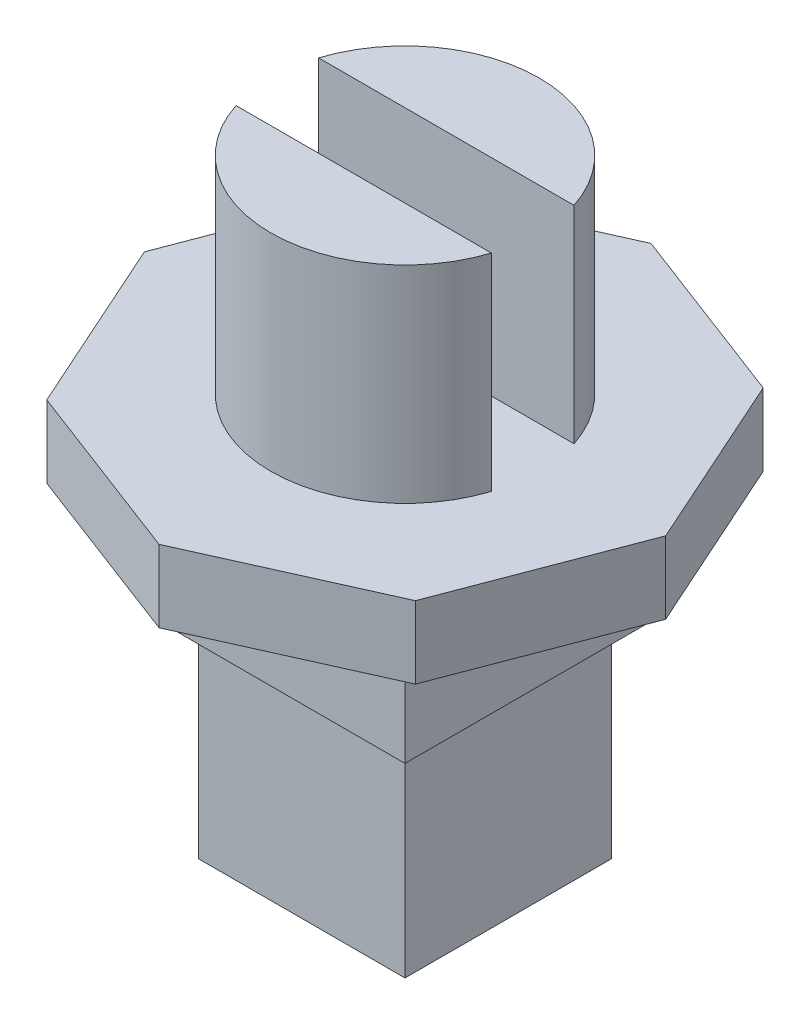
ISO-10303-21;
HEADER;
FILE_DESCRIPTION(('STEP AP214'),'2;1');
FILE_NAME('part.step','',(''),(''),'','','');
FILE_SCHEMA(('AUTOMOTIVE_DESIGN { 1 0 10303 214 1 1 1 1 }'));
ENDSEC;
DATA;
#1=APPLICATION_CONTEXT('core data for automotive mechanical design processes');
#2=APPLICATION_PROTOCOL_DEFINITION('international standard','automotive_design',2000,#1);
#3=PRODUCT_CONTEXT('',#1,'mechanical');
#4=PRODUCT('Part','Part','',(#3));
#5=PRODUCT_RELATED_PRODUCT_CATEGORY('part','',(#4));
#6=PRODUCT_DEFINITION_FORMATION('','',#4);
#7=PRODUCT_DEFINITION_CONTEXT('part definition',#1,'design');
#8=PRODUCT_DEFINITION('design','',#6,#7);
#9=PRODUCT_DEFINITION_SHAPE('','',#8);
#10=(LENGTH_UNIT() NAMED_UNIT(*) SI_UNIT(.MILLI.,.METRE.));
#11=(NAMED_UNIT(*) PLANE_ANGLE_UNIT() SI_UNIT($,.RADIAN.));
#12=(NAMED_UNIT(*) SI_UNIT($,.STERADIAN.) SOLID_ANGLE_UNIT());
#13=UNCERTAINTY_MEASURE_WITH_UNIT(LENGTH_MEASURE(1.E-05),#10,'distance_accuracy_value','');
#14=(GEOMETRIC_REPRESENTATION_CONTEXT(3) GLOBAL_UNCERTAINTY_ASSIGNED_CONTEXT((#13)) GLOBAL_UNIT_ASSIGNED_CONTEXT((#10,
#11,#12)) REPRESENTATION_CONTEXT('',''));
#15=CARTESIAN_POINT('',(0.,0.,0.));
#16=DIRECTION('',(0.,0.,1.));
#17=DIRECTION('',(1.,0.,0.));
#18=AXIS2_PLACEMENT_3D('',#15,#16,#17);
#19=CARTESIAN_POINT('',(5.,-10.,-5.));
#20=DIRECTION('',(1.,0.,0.));
#21=DIRECTION('',(0.,0.,-1.));
#22=AXIS2_PLACEMENT_3D('',#19,#20,#21);
#23=PLANE('',#22);
#24=DIRECTION('',(0.,0.,-1.));
#25=VECTOR('',#24,1.);
#26=CARTESIAN_POINT('',(5.,0.,-5.));
#27=LINE('',#26,#25);
#28=CARTESIAN_POINT('',(5.,0.,5.));
#29=VERTEX_POINT('',#28);
#30=CARTESIAN_POINT('',(5.,0.,-5.));
#31=VERTEX_POINT('',#30);
#32=EDGE_CURVE('E350',#29,#31,#27,.T.);
#33=ORIENTED_EDGE('',*,*,#32,.F.);
#34=DIRECTION('',(0.,1.,0.));
#35=VECTOR('',#34,1.);
#36=CARTESIAN_POINT('',(5.,-10.,5.));
#37=LINE('',#36,#35);
#38=CARTESIAN_POINT('',(5.,-10.,5.));
#39=VERTEX_POINT('',#38);
#40=EDGE_CURVE('E11',#39,#29,#37,.T.);
#41=ORIENTED_EDGE('',*,*,#40,.F.);
#42=DIRECTION('',(0.,0.,-1.));
#43=VECTOR('',#42,1.);
#44=CARTESIAN_POINT('',(5.,-10.,-5.));
#45=LINE('',#44,#43);
#46=CARTESIAN_POINT('',(5.,-10.,-5.));
#47=VERTEX_POINT('',#46);
#48=EDGE_CURVE('E351',#39,#47,#45,.T.);
#49=ORIENTED_EDGE('',*,*,#48,.T.);
#50=DIRECTION('',(0.,1.,0.));
#51=VECTOR('',#50,1.);
#52=CARTESIAN_POINT('',(5.,-10.,-5.));
#53=LINE('',#52,#51);
#54=EDGE_CURVE('E42',#47,#31,#53,.T.);
#55=ORIENTED_EDGE('',*,*,#54,.T.);
#56=EDGE_LOOP('',(#33,#41,#49,#55));
#57=FACE_BOUND('',#56,.T.);
#58=ADVANCED_FACE('F39',(#57),#23,.T.);
#59=CARTESIAN_POINT('',(-5.,-10.,5.));
#60=DIRECTION('',(0.,0.,1.));
#61=DIRECTION('',(1.,0.,0.));
#62=AXIS2_PLACEMENT_3D('',#59,#60,#61);
#63=PLANE('',#62);
#64=DIRECTION('',(1.,0.,0.));
#65=VECTOR('',#64,1.);
#66=CARTESIAN_POINT('',(-5.,0.,5.));
#67=LINE('',#66,#65);
#68=CARTESIAN_POINT('',(-5.,0.,5.));
#69=VERTEX_POINT('',#68);
#70=EDGE_CURVE('E356',#69,#29,#67,.T.);
#71=ORIENTED_EDGE('',*,*,#70,.F.);
#72=DIRECTION('',(0.,1.,0.));
#73=VECTOR('',#72,1.);
#74=CARTESIAN_POINT('',(-5.,-10.,5.));
#75=LINE('',#74,#73);
#76=CARTESIAN_POINT('',(-5.,-10.,5.));
#77=VERTEX_POINT('',#76);
#78=EDGE_CURVE('E48',#77,#69,#75,.T.);
#79=ORIENTED_EDGE('',*,*,#78,.F.);
#80=DIRECTION('',(1.,0.,0.));
#81=VECTOR('',#80,1.);
#82=CARTESIAN_POINT('',(-5.,-10.,5.));
#83=LINE('',#82,#81);
#84=EDGE_CURVE('E364',#77,#39,#83,.T.);
#85=ORIENTED_EDGE('',*,*,#84,.T.);
#86=ORIENTED_EDGE('',*,*,#40,.T.);
#87=EDGE_LOOP('',(#71,#79,#85,#86));
#88=FACE_BOUND('',#87,.T.);
#89=ADVANCED_FACE('F397',(#88),#63,.T.);
#90=CARTESIAN_POINT('',(-5.,-10.,-5.));
#91=DIRECTION('',(-1.,0.,0.));
#92=DIRECTION('',(0.,0.,1.));
#93=AXIS2_PLACEMENT_3D('',#90,#91,#92);
#94=PLANE('',#93);
#95=DIRECTION('',(0.,0.,1.));
#96=VECTOR('',#95,1.);
#97=CARTESIAN_POINT('',(-5.,0.,-5.));
#98=LINE('',#97,#96);
#99=CARTESIAN_POINT('',(-5.,0.,-5.));
#100=VERTEX_POINT('',#99);
#101=EDGE_CURVE('E375',#100,#69,#98,.T.);
#102=ORIENTED_EDGE('',*,*,#101,.F.);
#103=DIRECTION('',(0.,1.,0.));
#104=VECTOR('',#103,1.);
#105=CARTESIAN_POINT('',(-5.,-10.,-5.));
#106=LINE('',#105,#104);
#107=CARTESIAN_POINT('',(-5.,-10.,-5.));
#108=VERTEX_POINT('',#107);
#109=EDGE_CURVE('E383',#108,#100,#106,.T.);
#110=ORIENTED_EDGE('',*,*,#109,.F.);
#111=DIRECTION('',(0.,0.,1.));
#112=VECTOR('',#111,1.);
#113=CARTESIAN_POINT('',(-5.,-10.,-5.));
#114=LINE('',#113,#112);
#115=EDGE_CURVE('E360',#108,#77,#114,.T.);
#116=ORIENTED_EDGE('',*,*,#115,.T.);
#117=ORIENTED_EDGE('',*,*,#78,.T.);
#118=EDGE_LOOP('',(#102,#110,#116,#117));
#119=FACE_BOUND('',#118,.T.);
#120=ADVANCED_FACE('F403',(#119),#94,.T.);
#121=CARTESIAN_POINT('',(-5.,-10.,-5.));
#122=DIRECTION('',(0.,0.,-1.));
#123=DIRECTION('',(-1.,0.,0.));
#124=AXIS2_PLACEMENT_3D('',#121,#122,#123);
#125=PLANE('',#124);
#126=DIRECTION('',(-1.,0.,0.));
#127=VECTOR('',#126,1.);
#128=CARTESIAN_POINT('',(-5.,0.,-5.));
#129=LINE('',#128,#127);
#130=EDGE_CURVE('E371',#31,#100,#129,.T.);
#131=ORIENTED_EDGE('',*,*,#130,.F.);
#132=ORIENTED_EDGE('',*,*,#54,.F.);
#133=DIRECTION('',(-1.,0.,0.));
#134=VECTOR('',#133,1.);
#135=CARTESIAN_POINT('',(-5.,-10.,-5.));
#136=LINE('',#135,#134);
#137=EDGE_CURVE('E355',#47,#108,#136,.T.);
#138=ORIENTED_EDGE('',*,*,#137,.T.);
#139=ORIENTED_EDGE('',*,*,#109,.T.);
#140=EDGE_LOOP('',(#131,#132,#138,#139));
#141=FACE_BOUND('',#140,.T.);
#142=ADVANCED_FACE('F392',(#141),#125,.T.);
#143=CARTESIAN_POINT('',(0.,-10.,0.));
#144=DIRECTION('',(0.,1.,0.));
#145=DIRECTION('',(0.,0.,1.));
#146=AXIS2_PLACEMENT_3D('',#143,#144,#145);
#147=PLANE('',#146);
#148=ORIENTED_EDGE('',*,*,#48,.F.);
#149=ORIENTED_EDGE('',*,*,#84,.F.);
#150=ORIENTED_EDGE('',*,*,#115,.F.);
#151=ORIENTED_EDGE('',*,*,#137,.F.);
#152=EDGE_LOOP('',(#148,#149,#150,#151));
#153=FACE_BOUND('',#152,.T.);
#154=ADVANCED_FACE('F400',(#153),#147,.F.);
#155=CARTESIAN_POINT('',(0.,0.,0.));
#156=DIRECTION('',(0.,1.,0.));
#157=DIRECTION('',(0.,0.,1.));
#158=AXIS2_PLACEMENT_3D('',#155,#156,#157);
#159=PLANE('',#158);
#160=DIRECTION('',(0.,0.,-1.));
#161=VECTOR('',#160,1.);
#162=CARTESIAN_POINT('',(6.,0.,-6.));
#163=LINE('',#162,#161);
#164=CARTESIAN_POINT('',(6.,0.,6.));
#165=VERTEX_POINT('',#164);
#166=CARTESIAN_POINT('',(6.,0.,-6.));
#167=VERTEX_POINT('',#166);
#168=EDGE_CURVE('E305',#165,#167,#163,.T.);
#169=ORIENTED_EDGE('',*,*,#168,.F.);
#170=DIRECTION('',(1.,0.,0.));
#171=VECTOR('',#170,1.);
#172=CARTESIAN_POINT('',(-6.,0.,6.));
#173=LINE('',#172,#171);
#174=CARTESIAN_POINT('',(-6.,0.,6.));
#175=VERTEX_POINT('',#174);
#176=EDGE_CURVE('E311',#175,#165,#173,.T.);
#177=ORIENTED_EDGE('',*,*,#176,.F.);
#178=DIRECTION('',(0.,0.,1.));
#179=VECTOR('',#178,1.);
#180=CARTESIAN_POINT('',(-6.,0.,-6.));
#181=LINE('',#180,#179);
#182=CARTESIAN_POINT('',(-6.,0.,-6.));
#183=VERTEX_POINT('',#182);
#184=EDGE_CURVE('E330',#183,#175,#181,.T.);
#185=ORIENTED_EDGE('',*,*,#184,.F.);
#186=DIRECTION('',(-1.,0.,0.));
#187=VECTOR('',#186,1.);
#188=CARTESIAN_POINT('',(-6.,0.,-6.));
#189=LINE('',#188,#187);
#190=EDGE_CURVE('E327',#167,#183,#189,.T.);
#191=ORIENTED_EDGE('',*,*,#190,.F.);
#192=EDGE_LOOP('',(#169,#177,#185,#191));
#193=FACE_BOUND('',#192,.T.);
#194=ORIENTED_EDGE('',*,*,#70,.T.);
#195=ORIENTED_EDGE('',*,*,#32,.T.);
#196=ORIENTED_EDGE('',*,*,#130,.T.);
#197=ORIENTED_EDGE('',*,*,#101,.T.);
#198=EDGE_LOOP('',(#194,#195,#196,#197));
#199=FACE_BOUND('',#198,.T.);
#200=ADVANCED_FACE('F394',(#193,#199),#159,.F.);
#201=CARTESIAN_POINT('',(6.,6.,-6.));
#202=DIRECTION('',(-1.,0.,0.));
#203=DIRECTION('',(0.,0.,1.));
#204=AXIS2_PLACEMENT_3D('',#201,#202,#203);
#205=PLANE('',#204);
#206=ORIENTED_EDGE('',*,*,#168,.T.);
#207=DIRECTION('',(0.,-1.,0.));
#208=VECTOR('',#207,1.);
#209=CARTESIAN_POINT('',(6.,6.,-6.));
#210=LINE('',#209,#208);
#211=CARTESIAN_POINT('',(6.,6.,-6.));
#212=VERTEX_POINT('',#211);
#213=EDGE_CURVE('E346',#212,#167,#210,.T.);
#214=ORIENTED_EDGE('',*,*,#213,.F.);
#215=DIRECTION('',(0.,0.,-1.));
#216=VECTOR('',#215,1.);
#217=CARTESIAN_POINT('',(6.,6.,-6.));
#218=LINE('',#217,#216);
#219=CARTESIAN_POINT('',(6.,6.,6.));
#220=VERTEX_POINT('',#219);
#221=EDGE_CURVE('E306',#220,#212,#218,.T.);
#222=ORIENTED_EDGE('',*,*,#221,.F.);
#223=DIRECTION('',(0.,-1.,0.));
#224=VECTOR('',#223,1.);
#225=CARTESIAN_POINT('',(6.,6.,6.));
#226=LINE('',#225,#224);
#227=EDGE_CURVE('E323',#220,#165,#226,.T.);
#228=ORIENTED_EDGE('',*,*,#227,.T.);
#229=EDGE_LOOP('',(#206,#214,#222,#228));
#230=FACE_BOUND('',#229,.T.);
#231=ADVANCED_FACE('F440',(#230),#205,.F.);
#232=CARTESIAN_POINT('',(-6.,6.,-6.));
#233=DIRECTION('',(0.,0.,1.));
#234=DIRECTION('',(1.,0.,0.));
#235=AXIS2_PLACEMENT_3D('',#232,#233,#234);
#236=PLANE('',#235);
#237=ORIENTED_EDGE('',*,*,#190,.T.);
#238=DIRECTION('',(0.,-1.,0.));
#239=VECTOR('',#238,1.);
#240=CARTESIAN_POINT('',(-6.,6.,-6.));
#241=LINE('',#240,#239);
#242=CARTESIAN_POINT('',(-6.,6.,-6.));
#243=VERTEX_POINT('',#242);
#244=EDGE_CURVE('E342',#243,#183,#241,.T.);
#245=ORIENTED_EDGE('',*,*,#244,.F.);
#246=DIRECTION('',(-1.,0.,0.));
#247=VECTOR('',#246,1.);
#248=CARTESIAN_POINT('',(-6.,6.,-6.));
#249=LINE('',#248,#247);
#250=EDGE_CURVE('E310',#212,#243,#249,.T.);
#251=ORIENTED_EDGE('',*,*,#250,.F.);
#252=ORIENTED_EDGE('',*,*,#213,.T.);
#253=EDGE_LOOP('',(#237,#245,#251,#252));
#254=FACE_BOUND('',#253,.T.);
#255=ADVANCED_FACE('F450',(#254),#236,.F.);
#256=CARTESIAN_POINT('',(-6.,6.,-6.));
#257=DIRECTION('',(1.,0.,0.));
#258=DIRECTION('',(0.,0.,-1.));
#259=AXIS2_PLACEMENT_3D('',#256,#257,#258);
#260=PLANE('',#259);
#261=ORIENTED_EDGE('',*,*,#184,.T.);
#262=DIRECTION('',(0.,-1.,0.));
#263=VECTOR('',#262,1.);
#264=CARTESIAN_POINT('',(-6.,6.,6.));
#265=LINE('',#264,#263);
#266=CARTESIAN_POINT('',(-6.,6.,6.));
#267=VERTEX_POINT('',#266);
#268=EDGE_CURVE('E338',#267,#175,#265,.T.);
#269=ORIENTED_EDGE('',*,*,#268,.F.);
#270=DIRECTION('',(0.,0.,1.));
#271=VECTOR('',#270,1.);
#272=CARTESIAN_POINT('',(-6.,6.,-6.));
#273=LINE('',#272,#271);
#274=EDGE_CURVE('E315',#243,#267,#273,.T.);
#275=ORIENTED_EDGE('',*,*,#274,.F.);
#276=ORIENTED_EDGE('',*,*,#244,.T.);
#277=EDGE_LOOP('',(#261,#269,#275,#276));
#278=FACE_BOUND('',#277,.T.);
#279=ADVANCED_FACE('F460',(#278),#260,.F.);
#280=CARTESIAN_POINT('',(-6.,6.,6.));
#281=DIRECTION('',(0.,0.,-1.));
#282=DIRECTION('',(-1.,0.,0.));
#283=AXIS2_PLACEMENT_3D('',#280,#281,#282);
#284=PLANE('',#283);
#285=ORIENTED_EDGE('',*,*,#176,.T.);
#286=ORIENTED_EDGE('',*,*,#227,.F.);
#287=DIRECTION('',(1.,0.,0.));
#288=VECTOR('',#287,1.);
#289=CARTESIAN_POINT('',(-6.,6.,6.));
#290=LINE('',#289,#288);
#291=EDGE_CURVE('E319',#267,#220,#290,.T.);
#292=ORIENTED_EDGE('',*,*,#291,.F.);
#293=ORIENTED_EDGE('',*,*,#268,.T.);
#294=EDGE_LOOP('',(#285,#286,#292,#293));
#295=FACE_BOUND('',#294,.T.);
#296=ADVANCED_FACE('F470',(#295),#284,.F.);
#297=CARTESIAN_POINT('',(0.,6.,0.));
#298=DIRECTION('',(0.,1.,0.));
#299=DIRECTION('',(0.,0.,1.));
#300=AXIS2_PLACEMENT_3D('',#297,#298,#299);
#301=PLANE('',#300);
#302=DIRECTION('',(0.934598802416425,0.,0.355703638611954));
#303=VECTOR('',#302,1.);
#304=CARTESIAN_POINT('',(-8.42213623561176,6.,8.92593112096714));
#305=LINE('',#304,#303);
#306=CARTESIAN_POINT('',(-8.42213623561176,6.,8.92593112096714));
#307=VERTEX_POINT('',#306);
#308=CARTESIAN_POINT('',(0.356236779761883,6.,12.2669360683179));
#309=VERTEX_POINT('',#308);
#310=EDGE_CURVE('E223',#307,#309,#305,.T.);
#311=ORIENTED_EDGE('',*,*,#310,.F.);
#312=DIRECTION('',(0.409340695922239,0.,0.912381605832722));
#313=VECTOR('',#312,1.);
#314=CARTESIAN_POINT('',(-12.2669360683179,6.,0.356236779761885));
#315=LINE('',#314,#313);
#316=CARTESIAN_POINT('',(-12.2669360683179,6.,0.356236779761885));
#317=VERTEX_POINT('',#316);
#318=EDGE_CURVE('E229',#317,#307,#315,.T.);
#319=ORIENTED_EDGE('',*,*,#318,.F.);
#320=DIRECTION('',(-0.355703638611954,0.,0.934598802416425));
#321=VECTOR('',#320,1.);
#322=CARTESIAN_POINT('',(-8.92593112096714,6.,-8.42213623561176));
#323=LINE('',#322,#321);
#324=CARTESIAN_POINT('',(-8.92593112096714,6.,-8.42213623561176));
#325=VERTEX_POINT('',#324);
#326=EDGE_CURVE('E269',#325,#317,#323,.T.);
#327=ORIENTED_EDGE('',*,*,#326,.F.);
#328=DIRECTION('',(-0.912381605832722,0.,0.409340695922239));
#329=VECTOR('',#328,1.);
#330=CARTESIAN_POINT('',(-0.356236779761888,6.,-12.2669360683179));
#331=LINE('',#330,#329);
#332=CARTESIAN_POINT('',(-0.356236779761888,6.,-12.2669360683179));
#333=VERTEX_POINT('',#332);
#334=EDGE_CURVE('E266',#333,#325,#331,.T.);
#335=ORIENTED_EDGE('',*,*,#334,.F.);
#336=DIRECTION('',(-0.934598802416425,0.,-0.355703638611954));
#337=VECTOR('',#336,1.);
#338=CARTESIAN_POINT('',(8.42213623561176,6.,-8.92593112096714));
#339=LINE('',#338,#337);
#340=CARTESIAN_POINT('',(8.42213623561176,6.,-8.92593112096714));
#341=VERTEX_POINT('',#340);
#342=EDGE_CURVE('E263',#341,#333,#339,.T.);
#343=ORIENTED_EDGE('',*,*,#342,.F.);
#344=DIRECTION('',(-0.409340695922239,0.,-0.912381605832722));
#345=VECTOR('',#344,1.);
#346=CARTESIAN_POINT('',(12.2669360683179,6.,-0.356236779761891));
#347=LINE('',#346,#345);
#348=CARTESIAN_POINT('',(12.2669360683179,6.,-0.356236779761891));
#349=VERTEX_POINT('',#348);
#350=EDGE_CURVE('E260',#349,#341,#347,.T.);
#351=ORIENTED_EDGE('',*,*,#350,.F.);
#352=DIRECTION('',(0.355703638611954,0.,-0.934598802416425));
#353=VECTOR('',#352,1.);
#354=CARTESIAN_POINT('',(8.92593112096713,6.,8.42213623561176));
#355=LINE('',#354,#353);
#356=CARTESIAN_POINT('',(8.92593112096713,6.,8.42213623561176));
#357=VERTEX_POINT('',#356);
#358=EDGE_CURVE('E257',#357,#349,#355,.T.);
#359=ORIENTED_EDGE('',*,*,#358,.F.);
#360=DIRECTION('',(0.912381605832722,0.,-0.409340695922239));
#361=VECTOR('',#360,1.);
#362=CARTESIAN_POINT('',(0.356236779761883,6.,12.2669360683179));
#363=LINE('',#362,#361);
#364=EDGE_CURVE('E254',#309,#357,#363,.T.);
#365=ORIENTED_EDGE('',*,*,#364,.F.);
#366=EDGE_LOOP('',(#311,#319,#327,#335,#343,#351,#359,#365));
#367=FACE_BOUND('',#366,.T.);
#368=ORIENTED_EDGE('',*,*,#291,.T.);
#369=ORIENTED_EDGE('',*,*,#221,.T.);
#370=ORIENTED_EDGE('',*,*,#250,.T.);
#371=ORIENTED_EDGE('',*,*,#274,.T.);
#372=EDGE_LOOP('',(#368,#369,#370,#371));
#373=FACE_BOUND('',#372,.T.);
#374=ADVANCED_FACE('F480',(#367,#373),#301,.F.);
#375=CARTESIAN_POINT('',(-8.42213623561176,9.5,8.92593112096714));
#376=DIRECTION('',(0.355703638611954,0.,-0.934598802416425));
#377=DIRECTION('',(-0.934598802416425,0.,-0.355703638611954));
#378=AXIS2_PLACEMENT_3D('',#375,#376,#377);
#379=PLANE('',#378);
#380=ORIENTED_EDGE('',*,*,#310,.T.);
#381=DIRECTION('',(0.,-1.,0.));
#382=VECTOR('',#381,1.);
#383=CARTESIAN_POINT('',(0.356236779761883,9.5,12.2669360683179));
#384=LINE('',#383,#382);
#385=CARTESIAN_POINT('',(0.356236779761883,9.5,12.2669360683179));
#386=VERTEX_POINT('',#385);
#387=EDGE_CURVE('E301',#386,#309,#384,.T.);
#388=ORIENTED_EDGE('',*,*,#387,.F.);
#389=DIRECTION('',(0.934598802416425,0.,0.355703638611954));
#390=VECTOR('',#389,1.);
#391=CARTESIAN_POINT('',(-8.42213623561176,9.5,8.92593112096714));
#392=LINE('',#391,#390);
#393=CARTESIAN_POINT('',(-8.42213623561176,9.5,8.92593112096714));
#394=VERTEX_POINT('',#393);
#395=EDGE_CURVE('E224',#394,#386,#392,.T.);
#396=ORIENTED_EDGE('',*,*,#395,.F.);
#397=DIRECTION('',(0.,-1.,0.));
#398=VECTOR('',#397,1.);
#399=CARTESIAN_POINT('',(-8.42213623561176,9.5,8.92593112096714));
#400=LINE('',#399,#398);
#401=EDGE_CURVE('E250',#394,#307,#400,.T.);
#402=ORIENTED_EDGE('',*,*,#401,.T.);
#403=EDGE_LOOP('',(#380,#388,#396,#402));
#404=FACE_BOUND('',#403,.T.);
#405=ADVANCED_FACE('F490',(#404),#379,.F.);
#406=CARTESIAN_POINT('',(0.356236779761883,9.5,12.2669360683179));
#407=DIRECTION('',(-0.409340695922239,0.,-0.912381605832722));
#408=DIRECTION('',(-0.912381605832722,0.,0.409340695922239));
#409=AXIS2_PLACEMENT_3D('',#406,#407,#408);
#410=PLANE('',#409);
#411=ORIENTED_EDGE('',*,*,#364,.T.);
#412=DIRECTION('',(0.,-1.,0.));
#413=VECTOR('',#412,1.);
#414=CARTESIAN_POINT('',(8.92593112096713,9.5,8.42213623561176));
#415=LINE('',#414,#413);
#416=CARTESIAN_POINT('',(8.92593112096713,9.5,8.42213623561176));
#417=VERTEX_POINT('',#416);
#418=EDGE_CURVE('E297',#417,#357,#415,.T.);
#419=ORIENTED_EDGE('',*,*,#418,.F.);
#420=DIRECTION('',(0.912381605832722,0.,-0.409340695922239));
#421=VECTOR('',#420,1.);
#422=CARTESIAN_POINT('',(0.356236779761883,9.5,12.2669360683179));
#423=LINE('',#422,#421);
#424=EDGE_CURVE('E228',#386,#417,#423,.T.);
#425=ORIENTED_EDGE('',*,*,#424,.F.);
#426=ORIENTED_EDGE('',*,*,#387,.T.);
#427=EDGE_LOOP('',(#411,#419,#425,#426));
#428=FACE_BOUND('',#427,.T.);
#429=ADVANCED_FACE('F500',(#428),#410,.F.);
#430=CARTESIAN_POINT('',(8.92593112096713,9.5,8.42213623561176));
#431=DIRECTION('',(-0.934598802416425,0.,-0.355703638611954));
#432=DIRECTION('',(-0.355703638611954,0.,0.934598802416426));
#433=AXIS2_PLACEMENT_3D('',#430,#431,#432);
#434=PLANE('',#433);
#435=ORIENTED_EDGE('',*,*,#358,.T.);
#436=DIRECTION('',(0.,-1.,0.));
#437=VECTOR('',#436,1.);
#438=CARTESIAN_POINT('',(12.2669360683179,9.5,-0.356236779761891));
#439=LINE('',#438,#437);
#440=CARTESIAN_POINT('',(12.2669360683179,9.5,-0.356236779761891));
#441=VERTEX_POINT('',#440);
#442=EDGE_CURVE('E293',#441,#349,#439,.T.);
#443=ORIENTED_EDGE('',*,*,#442,.F.);
#444=DIRECTION('',(0.355703638611954,0.,-0.934598802416425));
#445=VECTOR('',#444,1.);
#446=CARTESIAN_POINT('',(8.92593112096713,9.5,8.42213623561176));
#447=LINE('',#446,#445);
#448=EDGE_CURVE('E232',#417,#441,#447,.T.);
#449=ORIENTED_EDGE('',*,*,#448,.F.);
#450=ORIENTED_EDGE('',*,*,#418,.T.);
#451=EDGE_LOOP('',(#435,#443,#449,#450));
#452=FACE_BOUND('',#451,.T.);
#453=ADVANCED_FACE('F510',(#452),#434,.F.);
#454=CARTESIAN_POINT('',(12.2669360683179,9.5,-0.356236779761891));
#455=DIRECTION('',(-0.912381605832722,0.,0.409340695922239));
#456=DIRECTION('',(0.409340695922239,0.,0.912381605832722));
#457=AXIS2_PLACEMENT_3D('',#454,#455,#456);
#458=PLANE('',#457);
#459=ORIENTED_EDGE('',*,*,#350,.T.);
#460=DIRECTION('',(0.,-1.,0.));
#461=VECTOR('',#460,1.);
#462=CARTESIAN_POINT('',(8.42213623561176,9.5,-8.92593112096714));
#463=LINE('',#462,#461);
#464=CARTESIAN_POINT('',(8.42213623561176,9.5,-8.92593112096714));
#465=VERTEX_POINT('',#464);
#466=EDGE_CURVE('E289',#465,#341,#463,.T.);
#467=ORIENTED_EDGE('',*,*,#466,.F.);
#468=DIRECTION('',(-0.409340695922239,0.,-0.912381605832722));
#469=VECTOR('',#468,1.);
#470=CARTESIAN_POINT('',(12.2669360683179,9.5,-0.356236779761891));
#471=LINE('',#470,#469);
#472=EDGE_CURVE('E235',#441,#465,#471,.T.);
#473=ORIENTED_EDGE('',*,*,#472,.F.);
#474=ORIENTED_EDGE('',*,*,#442,.T.);
#475=EDGE_LOOP('',(#459,#467,#473,#474));
#476=FACE_BOUND('',#475,.T.);
#477=ADVANCED_FACE('F520',(#476),#458,.F.);
#478=CARTESIAN_POINT('',(8.42213623561176,9.5,-8.92593112096714));
#479=DIRECTION('',(-0.355703638611954,0.,0.934598802416425));
#480=DIRECTION('',(0.934598802416426,0.,0.355703638611954));
#481=AXIS2_PLACEMENT_3D('',#478,#479,#480);
#482=PLANE('',#481);
#483=ORIENTED_EDGE('',*,*,#342,.T.);
#484=DIRECTION('',(0.,-1.,0.));
#485=VECTOR('',#484,1.);
#486=CARTESIAN_POINT('',(-0.356236779761888,9.5,-12.2669360683179));
#487=LINE('',#486,#485);
#488=CARTESIAN_POINT('',(-0.356236779761888,9.5,-12.2669360683179));
#489=VERTEX_POINT('',#488);
#490=EDGE_CURVE('E285',#489,#333,#487,.T.);
#491=ORIENTED_EDGE('',*,*,#490,.F.);
#492=DIRECTION('',(-0.934598802416425,0.,-0.355703638611954));
#493=VECTOR('',#492,1.);
#494=CARTESIAN_POINT('',(8.42213623561176,9.5,-8.92593112096714));
#495=LINE('',#494,#493);
#496=EDGE_CURVE('E238',#465,#489,#495,.T.);
#497=ORIENTED_EDGE('',*,*,#496,.F.);
#498=ORIENTED_EDGE('',*,*,#466,.T.);
#499=EDGE_LOOP('',(#483,#491,#497,#498));
#500=FACE_BOUND('',#499,.T.);
#501=ADVANCED_FACE('F530',(#500),#482,.F.);
#502=CARTESIAN_POINT('',(-0.356236779761888,9.5,-12.2669360683179));
#503=DIRECTION('',(0.409340695922239,0.,0.912381605832722));
#504=DIRECTION('',(0.912381605832722,0.,-0.409340695922239));
#505=AXIS2_PLACEMENT_3D('',#502,#503,#504);
#506=PLANE('',#505);
#507=ORIENTED_EDGE('',*,*,#334,.T.);
#508=DIRECTION('',(0.,-1.,0.));
#509=VECTOR('',#508,1.);
#510=CARTESIAN_POINT('',(-8.92593112096714,9.5,-8.42213623561176));
#511=LINE('',#510,#509);
#512=CARTESIAN_POINT('',(-8.92593112096714,9.5,-8.42213623561176));
#513=VERTEX_POINT('',#512);
#514=EDGE_CURVE('E281',#513,#325,#511,.T.);
#515=ORIENTED_EDGE('',*,*,#514,.F.);
#516=DIRECTION('',(-0.912381605832722,0.,0.409340695922239));
#517=VECTOR('',#516,1.);
#518=CARTESIAN_POINT('',(-0.356236779761888,9.5,-12.2669360683179));
#519=LINE('',#518,#517);
#520=EDGE_CURVE('E241',#489,#513,#519,.T.);
#521=ORIENTED_EDGE('',*,*,#520,.F.);
#522=ORIENTED_EDGE('',*,*,#490,.T.);
#523=EDGE_LOOP('',(#507,#515,#521,#522));
#524=FACE_BOUND('',#523,.T.);
#525=ADVANCED_FACE('F540',(#524),#506,.F.);
#526=CARTESIAN_POINT('',(-8.92593112096714,9.5,-8.42213623561176));
#527=DIRECTION('',(0.934598802416425,0.,0.355703638611954));
#528=DIRECTION('',(0.355703638611954,0.,-0.934598802416425));
#529=AXIS2_PLACEMENT_3D('',#526,#527,#528);
#530=PLANE('',#529);
#531=ORIENTED_EDGE('',*,*,#326,.T.);
#532=DIRECTION('',(0.,-1.,0.));
#533=VECTOR('',#532,1.);
#534=CARTESIAN_POINT('',(-12.2669360683179,9.5,0.356236779761885));
#535=LINE('',#534,#533);
#536=CARTESIAN_POINT('',(-12.2669360683179,9.5,0.356236779761885));
#537=VERTEX_POINT('',#536);
#538=EDGE_CURVE('E277',#537,#317,#535,.T.);
#539=ORIENTED_EDGE('',*,*,#538,.F.);
#540=DIRECTION('',(-0.355703638611954,0.,0.934598802416425));
#541=VECTOR('',#540,1.);
#542=CARTESIAN_POINT('',(-8.92593112096714,9.5,-8.42213623561176));
#543=LINE('',#542,#541);
#544=EDGE_CURVE('E244',#513,#537,#543,.T.);
#545=ORIENTED_EDGE('',*,*,#544,.F.);
#546=ORIENTED_EDGE('',*,*,#514,.T.);
#547=EDGE_LOOP('',(#531,#539,#545,#546));
#548=FACE_BOUND('',#547,.T.);
#549=ADVANCED_FACE('F550',(#548),#530,.F.);
#550=CARTESIAN_POINT('',(-12.2669360683179,9.5,0.356236779761885));
#551=DIRECTION('',(0.912381605832722,0.,-0.409340695922239));
#552=DIRECTION('',(-0.409340695922239,0.,-0.912381605832722));
#553=AXIS2_PLACEMENT_3D('',#550,#551,#552);
#554=PLANE('',#553);
#555=ORIENTED_EDGE('',*,*,#318,.T.);
#556=ORIENTED_EDGE('',*,*,#401,.F.);
#557=DIRECTION('',(0.409340695922239,0.,0.912381605832722));
#558=VECTOR('',#557,1.);
#559=CARTESIAN_POINT('',(-12.2669360683179,9.5,0.356236779761885));
#560=LINE('',#559,#558);
#561=EDGE_CURVE('E247',#537,#394,#560,.T.);
#562=ORIENTED_EDGE('',*,*,#561,.F.);
#563=ORIENTED_EDGE('',*,*,#538,.T.);
#564=EDGE_LOOP('',(#555,#556,#562,#563));
#565=FACE_BOUND('',#564,.T.);
#566=ADVANCED_FACE('F560',(#565),#554,.F.);
#567=CARTESIAN_POINT('',(0.,9.5,0.));
#568=DIRECTION('',(0.,1.,0.));
#569=DIRECTION('',(0.,0.,1.));
#570=AXIS2_PLACEMENT_3D('',#567,#568,#569);
#571=PLANE('',#570);
#572=CARTESIAN_POINT('',(0.,9.5,0.));
#573=DIRECTION('',(0.,1.,0.));
#574=DIRECTION('',(0.,0.,1.));
#575=AXIS2_PLACEMENT_3D('',#572,#573,#574);
#576=CIRCLE('',#575,6.5);
#577=CARTESIAN_POINT('',(-6.18465843842649,9.5,2.));
#578=VERTEX_POINT('',#577);
#579=CARTESIAN_POINT('',(6.18465843842649,9.5,2.));
#580=VERTEX_POINT('',#579);
#581=EDGE_CURVE('E182',#578,#580,#576,.T.);
#582=ORIENTED_EDGE('',*,*,#581,.F.);
#583=DIRECTION('',(-1.,0.,0.));
#584=VECTOR('',#583,1.);
#585=CARTESIAN_POINT('',(6.18465843842649,9.5,2.));
#586=LINE('',#585,#584);
#587=EDGE_CURVE('E56',#580,#578,#586,.T.);
#588=ORIENTED_EDGE('',*,*,#587,.F.);
#589=EDGE_LOOP('',(#582,#588));
#590=FACE_BOUND('',#589,.T.);
#591=CARTESIAN_POINT('',(0.,9.5,0.));
#592=DIRECTION('',(0.,1.,0.));
#593=DIRECTION('',(0.,0.,1.));
#594=AXIS2_PLACEMENT_3D('',#591,#592,#593);
#595=CIRCLE('',#594,6.5);
#596=CARTESIAN_POINT('',(6.18465843842649,9.5,-2.));
#597=VERTEX_POINT('',#596);
#598=CARTESIAN_POINT('',(-6.18465843842649,9.5,-2.));
#599=VERTEX_POINT('',#598);
#600=EDGE_CURVE('E201',#597,#599,#595,.T.);
#601=ORIENTED_EDGE('',*,*,#600,.F.);
#602=DIRECTION('',(1.,0.,0.));
#603=VECTOR('',#602,1.);
#604=CARTESIAN_POINT('',(-6.18465843842649,9.5,-2.));
#605=LINE('',#604,#603);
#606=EDGE_CURVE('E64',#599,#597,#605,.T.);
#607=ORIENTED_EDGE('',*,*,#606,.F.);
#608=EDGE_LOOP('',(#601,#607));
#609=FACE_BOUND('',#608,.T.);
#610=ORIENTED_EDGE('',*,*,#395,.T.);
#611=ORIENTED_EDGE('',*,*,#424,.T.);
#612=ORIENTED_EDGE('',*,*,#448,.T.);
#613=ORIENTED_EDGE('',*,*,#472,.T.);
#614=ORIENTED_EDGE('',*,*,#496,.T.);
#615=ORIENTED_EDGE('',*,*,#520,.T.);
#616=ORIENTED_EDGE('',*,*,#544,.T.);
#617=ORIENTED_EDGE('',*,*,#561,.T.);
#618=EDGE_LOOP('',(#610,#611,#612,#613,#614,#615,#616,#617));
#619=FACE_BOUND('',#618,.T.);
#620=ADVANCED_FACE('F196',(#590,#609,#619),#571,.T.);
#621=CARTESIAN_POINT('',(-6.18465843842649,19.5,-2.));
#622=DIRECTION('',(0.,0.,-1.));
#623=DIRECTION('',(-1.,0.,0.));
#624=AXIS2_PLACEMENT_3D('',#621,#622,#623);
#625=PLANE('',#624);
#626=ORIENTED_EDGE('',*,*,#606,.T.);
#627=DIRECTION('',(0.,-1.,0.));
#628=VECTOR('',#627,1.);
#629=CARTESIAN_POINT('',(6.18465843842649,19.5,-2.));
#630=LINE('',#629,#628);
#631=CARTESIAN_POINT('',(6.18465843842649,19.5,-2.));
#632=VERTEX_POINT('',#631);
#633=EDGE_CURVE('E220',#632,#597,#630,.T.);
#634=ORIENTED_EDGE('',*,*,#633,.F.);
#635=DIRECTION('',(1.,0.,0.));
#636=VECTOR('',#635,1.);
#637=CARTESIAN_POINT('',(-6.18465843842649,19.5,-2.));
#638=LINE('',#637,#636);
#639=CARTESIAN_POINT('',(-6.18465843842649,19.5,-2.));
#640=VERTEX_POINT('',#639);
#641=EDGE_CURVE('E208',#640,#632,#638,.T.);
#642=ORIENTED_EDGE('',*,*,#641,.F.);
#643=DIRECTION('',(0.,-1.,0.));
#644=VECTOR('',#643,1.);
#645=CARTESIAN_POINT('',(-6.18465843842649,19.5,-2.));
#646=LINE('',#645,#644);
#647=EDGE_CURVE('E214',#640,#599,#646,.T.);
#648=ORIENTED_EDGE('',*,*,#647,.T.);
#649=EDGE_LOOP('',(#626,#634,#642,#648));
#650=FACE_BOUND('',#649,.T.);
#651=ADVANCED_FACE('F579',(#650),#625,.F.);
#652=CARTESIAN_POINT('',(0.,19.5,0.));
#653=DIRECTION('',(0.,-1.,0.));
#654=DIRECTION('',(0.,0.,-1.));
#655=AXIS2_PLACEMENT_3D('',#652,#653,#654);
#656=CYLINDRICAL_SURFACE('',#655,6.5);
#657=ORIENTED_EDGE('',*,*,#600,.T.);
#658=ORIENTED_EDGE('',*,*,#647,.F.);
#659=CARTESIAN_POINT('',(0.,19.5,0.));
#660=DIRECTION('',(0.,1.,0.));
#661=DIRECTION('',(0.,0.,1.));
#662=AXIS2_PLACEMENT_3D('',#659,#660,#661);
#663=CIRCLE('',#662,6.5);
#664=EDGE_CURVE('E212',#632,#640,#663,.T.);
#665=ORIENTED_EDGE('',*,*,#664,.F.);
#666=ORIENTED_EDGE('',*,*,#633,.T.);
#667=EDGE_LOOP('',(#657,#658,#665,#666));
#668=FACE_BOUND('',#667,.T.);
#669=ADVANCED_FACE('F588',(#668),#656,.T.);
#670=CARTESIAN_POINT('',(0.,19.5,0.));
#671=DIRECTION('',(0.,1.,0.));
#672=DIRECTION('',(0.,0.,1.));
#673=AXIS2_PLACEMENT_3D('',#670,#671,#672);
#674=PLANE('',#673);
#675=ORIENTED_EDGE('',*,*,#641,.T.);
#676=ORIENTED_EDGE('',*,*,#664,.T.);
#677=EDGE_LOOP('',(#675,#676));
#678=FACE_BOUND('',#677,.T.);
#679=ADVANCED_FACE('F597',(#678),#674,.T.);
#680=CARTESIAN_POINT('',(6.18465843842649,19.5,2.));
#681=DIRECTION('',(0.,0.,1.));
#682=DIRECTION('',(1.,0.,0.));
#683=AXIS2_PLACEMENT_3D('',#680,#681,#682);
#684=PLANE('',#683);
#685=ORIENTED_EDGE('',*,*,#587,.T.);
#686=DIRECTION('',(0.,-1.,0.));
#687=VECTOR('',#686,1.);
#688=CARTESIAN_POINT('',(-6.18465843842649,19.5,2.));
#689=LINE('',#688,#687);
#690=CARTESIAN_POINT('',(-6.18465843842649,19.5,2.));
#691=VERTEX_POINT('',#690);
#692=EDGE_CURVE('E186',#691,#578,#689,.T.);
#693=ORIENTED_EDGE('',*,*,#692,.F.);
#694=DIRECTION('',(-1.,0.,0.));
#695=VECTOR('',#694,1.);
#696=CARTESIAN_POINT('',(6.18465843842649,19.5,2.));
#697=LINE('',#696,#695);
#698=CARTESIAN_POINT('',(6.18465843842649,19.5,2.));
#699=VERTEX_POINT('',#698);
#700=EDGE_CURVE('E189',#699,#691,#697,.T.);
#701=ORIENTED_EDGE('',*,*,#700,.F.);
#702=DIRECTION('',(0.,-1.,0.));
#703=VECTOR('',#702,1.);
#704=CARTESIAN_POINT('',(6.18465843842649,19.5,2.));
#705=LINE('',#704,#703);
#706=EDGE_CURVE('E184',#699,#580,#705,.T.);
#707=ORIENTED_EDGE('',*,*,#706,.T.);
#708=EDGE_LOOP('',(#685,#693,#701,#707));
#709=FACE_BOUND('',#708,.T.);
#710=ADVANCED_FACE('F191',(#709),#684,.F.);
#711=CARTESIAN_POINT('',(0.,19.5,0.));
#712=DIRECTION('',(0.,-1.,0.));
#713=DIRECTION('',(0.,0.,-1.));
#714=AXIS2_PLACEMENT_3D('',#711,#712,#713);
#715=CYLINDRICAL_SURFACE('',#714,6.5);
#716=ORIENTED_EDGE('',*,*,#581,.T.);
#717=ORIENTED_EDGE('',*,*,#706,.F.);
#718=CARTESIAN_POINT('',(0.,19.5,0.));
#719=DIRECTION('',(0.,1.,0.));
#720=DIRECTION('',(0.,0.,1.));
#721=AXIS2_PLACEMENT_3D('',#718,#719,#720);
#722=CIRCLE('',#721,6.5);
#723=EDGE_CURVE('E194',#691,#699,#722,.T.);
#724=ORIENTED_EDGE('',*,*,#723,.F.);
#725=ORIENTED_EDGE('',*,*,#692,.T.);
#726=EDGE_LOOP('',(#716,#717,#724,#725));
#727=FACE_BOUND('',#726,.T.);
#728=ADVANCED_FACE('F183',(#727),#715,.T.);
#729=CARTESIAN_POINT('',(0.,19.5,0.));
#730=DIRECTION('',(0.,1.,0.));
#731=DIRECTION('',(0.,0.,1.));
#732=AXIS2_PLACEMENT_3D('',#729,#730,#731);
#733=PLANE('',#732);
#734=ORIENTED_EDGE('',*,*,#700,.T.);
#735=ORIENTED_EDGE('',*,*,#723,.T.);
#736=EDGE_LOOP('',(#734,#735));
#737=FACE_BOUND('',#736,.T.);
#738=ADVANCED_FACE('F624',(#737),#733,.T.);
#739=CLOSED_SHELL('',(#58,#89,#120,#142,#154,#200,#231,#255,#279,#296,#374,#405,#429,#453,#477,
#501,#525,#549,#566,#620,#651,#669,#679,#710,#728,#738));
#740=MANIFOLD_SOLID_BREP('B2',#739);
#741=ADVANCED_BREP_SHAPE_REPRESENTATION('',(#18,#740),#14);
#742=SHAPE_DEFINITION_REPRESENTATION(#9,#741);
ENDSEC;
END-ISO-10303-21;
